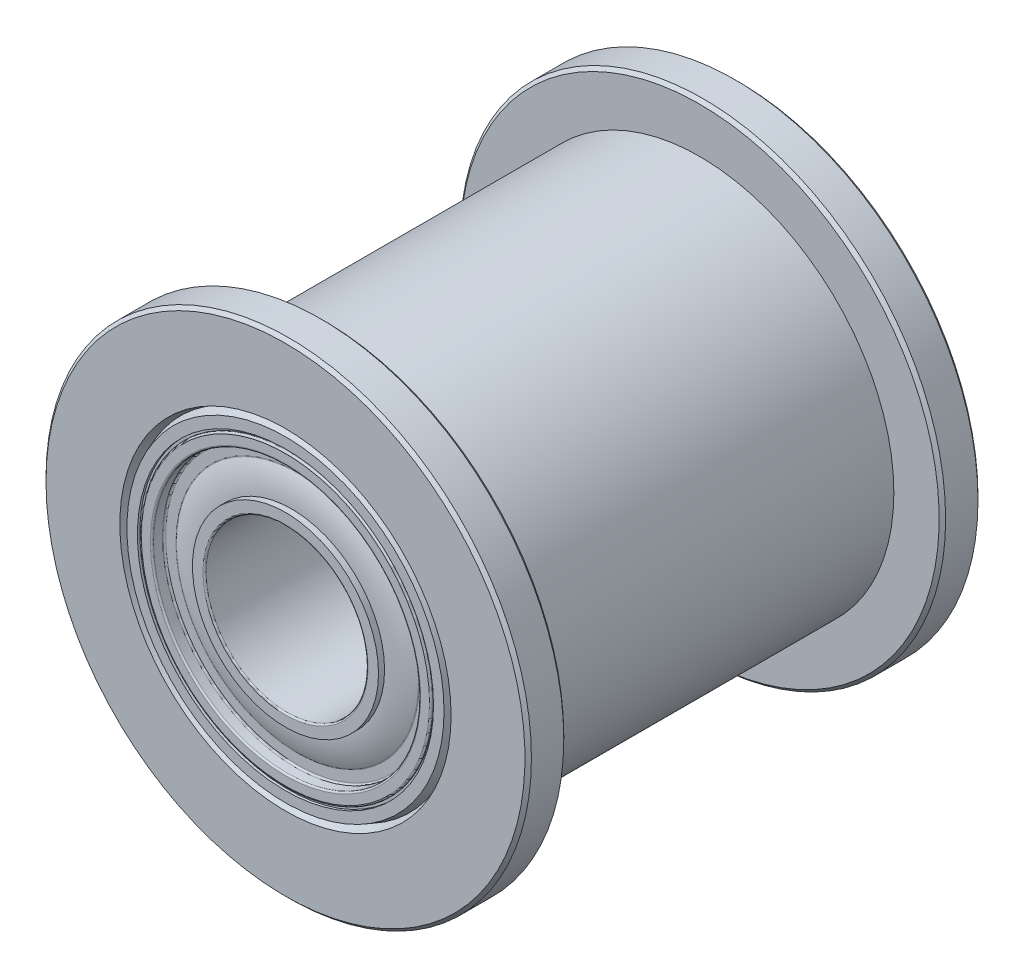
ISO-10303-21;
HEADER;
FILE_DESCRIPTION(('STEP AP214'),'2;1');
FILE_NAME('part.step','',(''),(''),'','','');
FILE_SCHEMA(('AUTOMOTIVE_DESIGN { 1 0 10303 214 1 1 1 1 }'));
ENDSEC;
DATA;
#1=APPLICATION_CONTEXT('core data for automotive mechanical design processes');
#2=APPLICATION_PROTOCOL_DEFINITION('international standard','automotive_design',2000,#1);
#3=PRODUCT_CONTEXT('',#1,'mechanical');
#4=PRODUCT('Part','Part','',(#3));
#5=PRODUCT_RELATED_PRODUCT_CATEGORY('part','',(#4));
#6=PRODUCT_DEFINITION_FORMATION('','',#4);
#7=PRODUCT_DEFINITION_CONTEXT('part definition',#1,'design');
#8=PRODUCT_DEFINITION('design','',#6,#7);
#9=PRODUCT_DEFINITION_SHAPE('','',#8);
#10=(LENGTH_UNIT() NAMED_UNIT(*) SI_UNIT(.MILLI.,.METRE.));
#11=(NAMED_UNIT(*) PLANE_ANGLE_UNIT() SI_UNIT($,.RADIAN.));
#12=(NAMED_UNIT(*) SI_UNIT($,.STERADIAN.) SOLID_ANGLE_UNIT());
#13=UNCERTAINTY_MEASURE_WITH_UNIT(LENGTH_MEASURE(1.E-05),#10,'distance_accuracy_value','');
#14=(GEOMETRIC_REPRESENTATION_CONTEXT(3) GLOBAL_UNCERTAINTY_ASSIGNED_CONTEXT((#13)) GLOBAL_UNIT_ASSIGNED_CONTEXT((#10,
#11,#12)) REPRESENTATION_CONTEXT('',''));
#15=CARTESIAN_POINT('',(0.,0.,0.));
#16=DIRECTION('',(0.,0.,1.));
#17=DIRECTION('',(1.,0.,0.));
#18=AXIS2_PLACEMENT_3D('',#15,#16,#17);
#19=CARTESIAN_POINT('',(0.,7.5,-5.8));
#20=DIRECTION('',(0.,0.,-1.));
#21=DIRECTION('',(-1.,0.,0.));
#22=AXIS2_PLACEMENT_3D('',#19,#20,#21);
#23=PLANE('',#22);
#24=CARTESIAN_POINT('',(0.,0.,-5.8));
#25=DIRECTION('',(0.,0.,-1.));
#26=DIRECTION('',(-1.,0.,0.));
#27=AXIS2_PLACEMENT_3D('',#24,#25,#26);
#28=CIRCLE('',#27,7.40000000000001);
#29=CARTESIAN_POINT('',(-7.40000000000001,0.,-5.8));
#30=VERTEX_POINT('',#29);
#31=EDGE_CURVE('E57',#30,#30,#28,.F.);
#32=ORIENTED_EDGE('',*,*,#31,.T.);
#33=EDGE_LOOP('',(#32));
#34=FACE_BOUND('',#33,.T.);
#35=CARTESIAN_POINT('',(0.,0.,-5.8));
#36=DIRECTION('',(0.,0.,1.));
#37=DIRECTION('',(1.,0.,0.));
#38=AXIS2_PLACEMENT_3D('',#35,#36,#37);
#39=CIRCLE('',#38,6.);
#40=CARTESIAN_POINT('',(6.,0.,-5.8));
#41=VERTEX_POINT('',#40);
#42=EDGE_CURVE('E88',#41,#41,#39,.T.);
#43=ORIENTED_EDGE('',*,*,#42,.F.);
#44=EDGE_LOOP('',(#43));
#45=FACE_BOUND('',#44,.T.);
#46=ADVANCED_FACE('F37',(#34,#45),#23,.F.);
#47=CARTESIAN_POINT('',(0.,0.,7.));
#48=DIRECTION('',(0.,0.,1.));
#49=DIRECTION('',(1.,0.,0.));
#50=AXIS2_PLACEMENT_3D('',#47,#48,#49);
#51=CYLINDRICAL_SURFACE('',#50,7.5);
#52=CARTESIAN_POINT('',(0.,0.,-6.9));
#53=DIRECTION('',(0.,0.,1.));
#54=DIRECTION('',(1.,0.,0.));
#55=AXIS2_PLACEMENT_3D('',#52,#53,#54);
#56=CIRCLE('',#55,7.5);
#57=CARTESIAN_POINT('',(7.5,0.,-6.9));
#58=VERTEX_POINT('',#57);
#59=EDGE_CURVE('E63',#58,#58,#56,.T.);
#60=ORIENTED_EDGE('',*,*,#59,.T.);
#61=EDGE_LOOP('',(#60));
#62=FACE_BOUND('',#61,.T.);
#63=CARTESIAN_POINT('',(0.,0.,-5.9));
#64=DIRECTION('',(0.,0.,-1.));
#65=DIRECTION('',(-1.,0.,0.));
#66=AXIS2_PLACEMENT_3D('',#63,#64,#65);
#67=CIRCLE('',#66,7.5);
#68=CARTESIAN_POINT('',(-7.5,0.,-5.9));
#69=VERTEX_POINT('',#68);
#70=EDGE_CURVE('E66',#69,#69,#67,.T.);
#71=ORIENTED_EDGE('',*,*,#70,.T.);
#72=EDGE_LOOP('',(#71));
#73=FACE_BOUND('',#72,.T.);
#74=ADVANCED_FACE('F203',(#62,#73),#51,.T.);
#75=CARTESIAN_POINT('',(0.,7.5,-7.));
#76=DIRECTION('',(0.,0.,1.));
#77=DIRECTION('',(1.,0.,0.));
#78=AXIS2_PLACEMENT_3D('',#75,#76,#77);
#79=PLANE('',#78);
#80=CARTESIAN_POINT('',(0.,0.,-7.));
#81=DIRECTION('',(0.,0.,1.));
#82=DIRECTION('',(1.,0.,0.));
#83=AXIS2_PLACEMENT_3D('',#80,#81,#82);
#84=CIRCLE('',#83,7.4);
#85=CARTESIAN_POINT('',(7.4,0.,-7.));
#86=VERTEX_POINT('',#85);
#87=EDGE_CURVE('E60',#86,#86,#84,.F.);
#88=ORIENTED_EDGE('',*,*,#87,.T.);
#89=EDGE_LOOP('',(#88));
#90=FACE_BOUND('',#89,.T.);
#91=CARTESIAN_POINT('',(0.,0.,-7.));
#92=DIRECTION('',(0.,0.,1.));
#93=DIRECTION('',(1.,0.,0.));
#94=AXIS2_PLACEMENT_3D('',#91,#92,#93);
#95=CIRCLE('',#94,5.11838214055972);
#96=CARTESIAN_POINT('',(5.11838214055972,0.,-7.));
#97=VERTEX_POINT('',#96);
#98=EDGE_CURVE('E69',#97,#97,#95,.T.);
#99=ORIENTED_EDGE('',*,*,#98,.T.);
#100=EDGE_LOOP('',(#99));
#101=FACE_BOUND('',#100,.T.);
#102=ADVANCED_FACE('F209',(#90,#101),#79,.F.);
#103=CARTESIAN_POINT('',(0.,0.,-6.7));
#104=DIRECTION('',(0.,0.,-1.));
#105=DIRECTION('',(-1.,0.,0.));
#106=AXIS2_PLACEMENT_3D('',#103,#104,#105);
#107=CONICAL_SURFACE('',#106,5.00919107027986,0.349065850398864);
#108=ORIENTED_EDGE('',*,*,#98,.F.);
#109=EDGE_LOOP('',(#108));
#110=FACE_BOUND('',#109,.T.);
#111=CARTESIAN_POINT('',(0.,0.,-6.7));
#112=DIRECTION('',(0.,0.,1.));
#113=DIRECTION('',(1.,0.,0.));
#114=AXIS2_PLACEMENT_3D('',#111,#112,#113);
#115=CIRCLE('',#114,5.00919107027986);
#116=CARTESIAN_POINT('',(5.00919107027986,0.,-6.7));
#117=VERTEX_POINT('',#116);
#118=EDGE_CURVE('E72',#117,#117,#115,.T.);
#119=ORIENTED_EDGE('',*,*,#118,.T.);
#120=EDGE_LOOP('',(#119));
#121=FACE_BOUND('',#120,.T.);
#122=ADVANCED_FACE('F285',(#110,#121),#107,.F.);
#123=CARTESIAN_POINT('',(0.,0.,-7.));
#124=DIRECTION('',(0.,0.,1.));
#125=DIRECTION('',(1.,0.,0.));
#126=AXIS2_PLACEMENT_3D('',#123,#124,#125);
#127=CONICAL_SURFACE('',#126,4.9,0.349065850398864);
#128=ORIENTED_EDGE('',*,*,#118,.F.);
#129=EDGE_LOOP('',(#128));
#130=FACE_BOUND('',#129,.T.);
#131=CARTESIAN_POINT('',(0.,0.,-7.));
#132=DIRECTION('',(0.,0.,1.));
#133=DIRECTION('',(1.,0.,0.));
#134=AXIS2_PLACEMENT_3D('',#131,#132,#133);
#135=CIRCLE('',#134,4.9);
#136=CARTESIAN_POINT('',(4.9,0.,-7.));
#137=VERTEX_POINT('',#136);
#138=EDGE_CURVE('E75',#137,#137,#135,.T.);
#139=ORIENTED_EDGE('',*,*,#138,.T.);
#140=EDGE_LOOP('',(#139));
#141=FACE_BOUND('',#140,.T.);
#142=ADVANCED_FACE('F281',(#130,#141),#127,.T.);
#143=CARTESIAN_POINT('',(0.,4.9,-7.));
#144=DIRECTION('',(0.,0.,1.));
#145=DIRECTION('',(1.,0.,0.));
#146=AXIS2_PLACEMENT_3D('',#143,#144,#145);
#147=PLANE('',#146);
#148=ORIENTED_EDGE('',*,*,#138,.F.);
#149=EDGE_LOOP('',(#148));
#150=FACE_BOUND('',#149,.T.);
#151=CARTESIAN_POINT('',(0.,0.,-7.));
#152=DIRECTION('',(0.,0.,1.));
#153=DIRECTION('',(1.,0.,0.));
#154=AXIS2_PLACEMENT_3D('',#151,#152,#153);
#155=CIRCLE('',#154,4.575);
#156=CARTESIAN_POINT('',(4.575,0.,-7.));
#157=VERTEX_POINT('',#156);
#158=EDGE_CURVE('E78',#157,#157,#155,.T.);
#159=ORIENTED_EDGE('',*,*,#158,.T.);
#160=EDGE_LOOP('',(#159));
#161=FACE_BOUND('',#160,.T.);
#162=ADVANCED_FACE('F277',(#150,#161),#147,.F.);
#163=CARTESIAN_POINT('',(0.,0.,7.));
#164=DIRECTION('',(0.,0.,1.));
#165=DIRECTION('',(1.,0.,0.));
#166=AXIS2_PLACEMENT_3D('',#163,#164,#165);
#167=CYLINDRICAL_SURFACE('',#166,4.575);
#168=ORIENTED_EDGE('',*,*,#158,.F.);
#169=EDGE_LOOP('',(#168));
#170=FACE_BOUND('',#169,.T.);
#171=CARTESIAN_POINT('',(0.,0.,-6.925));
#172=DIRECTION('',(0.,0.,1.));
#173=DIRECTION('',(1.,0.,0.));
#174=AXIS2_PLACEMENT_3D('',#171,#172,#173);
#175=CIRCLE('',#174,4.575);
#176=CARTESIAN_POINT('',(4.575,0.,-6.925));
#177=VERTEX_POINT('',#176);
#178=EDGE_CURVE('E81',#177,#177,#175,.T.);
#179=ORIENTED_EDGE('',*,*,#178,.T.);
#180=EDGE_LOOP('',(#179));
#181=FACE_BOUND('',#180,.T.);
#182=ADVANCED_FACE('F273',(#170,#181),#167,.F.);
#183=CARTESIAN_POINT('',(0.,4.5,-6.925));
#184=DIRECTION('',(0.,0.,1.));
#185=DIRECTION('',(1.,0.,0.));
#186=AXIS2_PLACEMENT_3D('',#183,#184,#185);
#187=PLANE('',#186);
#188=ORIENTED_EDGE('',*,*,#178,.F.);
#189=EDGE_LOOP('',(#188));
#190=FACE_BOUND('',#189,.T.);
#191=CARTESIAN_POINT('',(0.,0.,-6.925));
#192=DIRECTION('',(0.,0.,1.));
#193=DIRECTION('',(1.,0.,0.));
#194=AXIS2_PLACEMENT_3D('',#191,#192,#193);
#195=CIRCLE('',#194,4.5);
#196=CARTESIAN_POINT('',(4.5,0.,-6.925));
#197=VERTEX_POINT('',#196);
#198=EDGE_CURVE('E85',#197,#197,#195,.T.);
#199=ORIENTED_EDGE('',*,*,#198,.T.);
#200=EDGE_LOOP('',(#199));
#201=FACE_BOUND('',#200,.T.);
#202=ADVANCED_FACE('F269',(#190,#201),#187,.F.);
#203=CARTESIAN_POINT('',(0.,4.5,6.925));
#204=DIRECTION('',(0.,0.,-1.));
#205=DIRECTION('',(-1.,0.,0.));
#206=AXIS2_PLACEMENT_3D('',#203,#204,#205);
#207=PLANE('',#206);
#208=CARTESIAN_POINT('',(0.,0.,6.925));
#209=DIRECTION('',(0.,0.,1.));
#210=DIRECTION('',(1.,0.,0.));
#211=AXIS2_PLACEMENT_3D('',#208,#209,#210);
#212=CIRCLE('',#211,4.5);
#213=CARTESIAN_POINT('',(4.5,0.,6.925));
#214=VERTEX_POINT('',#213);
#215=EDGE_CURVE('E84',#214,#214,#212,.T.);
#216=ORIENTED_EDGE('',*,*,#215,.F.);
#217=EDGE_LOOP('',(#216));
#218=FACE_BOUND('',#217,.T.);
#219=CARTESIAN_POINT('',(0.,0.,6.925));
#220=DIRECTION('',(0.,0.,1.));
#221=DIRECTION('',(1.,0.,0.));
#222=AXIS2_PLACEMENT_3D('',#219,#220,#221);
#223=CIRCLE('',#222,4.575);
#224=CARTESIAN_POINT('',(4.575,0.,6.925));
#225=VERTEX_POINT('',#224);
#226=EDGE_CURVE('E92',#225,#225,#223,.T.);
#227=ORIENTED_EDGE('',*,*,#226,.T.);
#228=EDGE_LOOP('',(#227));
#229=FACE_BOUND('',#228,.T.);
#230=ADVANCED_FACE('F265',(#218,#229),#207,.F.);
#231=CARTESIAN_POINT('',(0.,0.,7.));
#232=DIRECTION('',(0.,0.,1.));
#233=DIRECTION('',(1.,0.,0.));
#234=AXIS2_PLACEMENT_3D('',#231,#232,#233);
#235=CYLINDRICAL_SURFACE('',#234,4.575);
#236=ORIENTED_EDGE('',*,*,#226,.F.);
#237=EDGE_LOOP('',(#236));
#238=FACE_BOUND('',#237,.T.);
#239=CARTESIAN_POINT('',(0.,0.,7.));
#240=DIRECTION('',(0.,0.,1.));
#241=DIRECTION('',(1.,0.,0.));
#242=AXIS2_PLACEMENT_3D('',#239,#240,#241);
#243=CIRCLE('',#242,4.575);
#244=CARTESIAN_POINT('',(4.575,0.,7.));
#245=VERTEX_POINT('',#244);
#246=EDGE_CURVE('E95',#245,#245,#243,.T.);
#247=ORIENTED_EDGE('',*,*,#246,.T.);
#248=EDGE_LOOP('',(#247));
#249=FACE_BOUND('',#248,.T.);
#250=ADVANCED_FACE('F261',(#238,#249),#235,.F.);
#251=CARTESIAN_POINT('',(0.,4.9,7.));
#252=DIRECTION('',(0.,0.,-1.));
#253=DIRECTION('',(-1.,0.,0.));
#254=AXIS2_PLACEMENT_3D('',#251,#252,#253);
#255=PLANE('',#254);
#256=ORIENTED_EDGE('',*,*,#246,.F.);
#257=EDGE_LOOP('',(#256));
#258=FACE_BOUND('',#257,.T.);
#259=CARTESIAN_POINT('',(0.,0.,7.));
#260=DIRECTION('',(0.,0.,1.));
#261=DIRECTION('',(1.,0.,0.));
#262=AXIS2_PLACEMENT_3D('',#259,#260,#261);
#263=CIRCLE('',#262,4.9);
#264=CARTESIAN_POINT('',(4.9,0.,7.));
#265=VERTEX_POINT('',#264);
#266=EDGE_CURVE('E98',#265,#265,#263,.T.);
#267=ORIENTED_EDGE('',*,*,#266,.T.);
#268=EDGE_LOOP('',(#267));
#269=FACE_BOUND('',#268,.T.);
#270=ADVANCED_FACE('F257',(#258,#269),#255,.F.);
#271=CARTESIAN_POINT('',(0.,0.,6.7));
#272=DIRECTION('',(0.,0.,-1.));
#273=DIRECTION('',(-1.,0.,0.));
#274=AXIS2_PLACEMENT_3D('',#271,#272,#273);
#275=CONICAL_SURFACE('',#274,5.00919107027986,0.349065850398864);
#276=ORIENTED_EDGE('',*,*,#266,.F.);
#277=EDGE_LOOP('',(#276));
#278=FACE_BOUND('',#277,.T.);
#279=CARTESIAN_POINT('',(0.,0.,6.7));
#280=DIRECTION('',(0.,0.,1.));
#281=DIRECTION('',(1.,0.,0.));
#282=AXIS2_PLACEMENT_3D('',#279,#280,#281);
#283=CIRCLE('',#282,5.00919107027986);
#284=CARTESIAN_POINT('',(5.00919107027986,0.,6.7));
#285=VERTEX_POINT('',#284);
#286=EDGE_CURVE('E101',#285,#285,#283,.T.);
#287=ORIENTED_EDGE('',*,*,#286,.T.);
#288=EDGE_LOOP('',(#287));
#289=FACE_BOUND('',#288,.T.);
#290=ADVANCED_FACE('F253',(#278,#289),#275,.T.);
#291=CARTESIAN_POINT('',(0.,0.,7.));
#292=DIRECTION('',(0.,0.,1.));
#293=DIRECTION('',(1.,0.,0.));
#294=AXIS2_PLACEMENT_3D('',#291,#292,#293);
#295=CONICAL_SURFACE('',#294,5.11838214055972,0.349065850398864);
#296=ORIENTED_EDGE('',*,*,#286,.F.);
#297=EDGE_LOOP('',(#296));
#298=FACE_BOUND('',#297,.T.);
#299=CARTESIAN_POINT('',(0.,0.,7.));
#300=DIRECTION('',(0.,0.,1.));
#301=DIRECTION('',(1.,0.,0.));
#302=AXIS2_PLACEMENT_3D('',#299,#300,#301);
#303=CIRCLE('',#302,5.11838214055972);
#304=CARTESIAN_POINT('',(5.11838214055972,0.,7.));
#305=VERTEX_POINT('',#304);
#306=EDGE_CURVE('E104',#305,#305,#303,.T.);
#307=ORIENTED_EDGE('',*,*,#306,.T.);
#308=EDGE_LOOP('',(#307));
#309=FACE_BOUND('',#308,.T.);
#310=ADVANCED_FACE('F247',(#298,#309),#295,.F.);
#311=CARTESIAN_POINT('',(0.,7.5,7.));
#312=DIRECTION('',(0.,0.,-1.));
#313=DIRECTION('',(-1.,0.,0.));
#314=AXIS2_PLACEMENT_3D('',#311,#312,#313);
#315=PLANE('',#314);
#316=CARTESIAN_POINT('',(0.,0.,7.));
#317=DIRECTION('',(0.,0.,-1.));
#318=DIRECTION('',(-1.,0.,0.));
#319=AXIS2_PLACEMENT_3D('',#316,#317,#318);
#320=CIRCLE('',#319,7.4);
#321=CARTESIAN_POINT('',(-7.4,0.,7.));
#322=VERTEX_POINT('',#321);
#323=EDGE_CURVE('E10',#322,#322,#320,.F.);
#324=ORIENTED_EDGE('',*,*,#323,.T.);
#325=EDGE_LOOP('',(#324));
#326=FACE_BOUND('',#325,.T.);
#327=ORIENTED_EDGE('',*,*,#306,.F.);
#328=EDGE_LOOP('',(#327));
#329=FACE_BOUND('',#328,.T.);
#330=ADVANCED_FACE('F238',(#326,#329),#315,.F.);
#331=CARTESIAN_POINT('',(0.,0.,7.));
#332=DIRECTION('',(0.,0.,1.));
#333=DIRECTION('',(1.,0.,0.));
#334=AXIS2_PLACEMENT_3D('',#331,#332,#333);
#335=CYLINDRICAL_SURFACE('',#334,7.5);
#336=CARTESIAN_POINT('',(0.,0.,5.9));
#337=DIRECTION('',(0.,0.,1.));
#338=DIRECTION('',(1.,0.,0.));
#339=AXIS2_PLACEMENT_3D('',#336,#337,#338);
#340=CIRCLE('',#339,7.5);
#341=CARTESIAN_POINT('',(7.5,0.,5.9));
#342=VERTEX_POINT('',#341);
#343=EDGE_CURVE('E48',#342,#342,#340,.T.);
#344=ORIENTED_EDGE('',*,*,#343,.T.);
#345=EDGE_LOOP('',(#344));
#346=FACE_BOUND('',#345,.T.);
#347=CARTESIAN_POINT('',(0.,0.,6.9));
#348=DIRECTION('',(0.,0.,-1.));
#349=DIRECTION('',(-1.,0.,0.));
#350=AXIS2_PLACEMENT_3D('',#347,#348,#349);
#351=CIRCLE('',#350,7.5);
#352=CARTESIAN_POINT('',(-7.5,0.,6.9));
#353=VERTEX_POINT('',#352);
#354=EDGE_CURVE('E52',#353,#353,#351,.T.);
#355=ORIENTED_EDGE('',*,*,#354,.T.);
#356=EDGE_LOOP('',(#355));
#357=FACE_BOUND('',#356,.T.);
#358=ADVANCED_FACE('F234',(#346,#357),#335,.T.);
#359=CARTESIAN_POINT('',(0.,7.5,5.8));
#360=DIRECTION('',(0.,0.,1.));
#361=DIRECTION('',(1.,0.,0.));
#362=AXIS2_PLACEMENT_3D('',#359,#360,#361);
#363=PLANE('',#362);
#364=CARTESIAN_POINT('',(0.,0.,5.8));
#365=DIRECTION('',(0.,0.,1.));
#366=DIRECTION('',(1.,0.,0.));
#367=AXIS2_PLACEMENT_3D('',#364,#365,#366);
#368=CIRCLE('',#367,7.4);
#369=CARTESIAN_POINT('',(7.4,0.,5.8));
#370=VERTEX_POINT('',#369);
#371=EDGE_CURVE('E44',#370,#370,#368,.F.);
#372=ORIENTED_EDGE('',*,*,#371,.T.);
#373=EDGE_LOOP('',(#372));
#374=FACE_BOUND('',#373,.T.);
#375=CARTESIAN_POINT('',(0.,0.,5.8));
#376=DIRECTION('',(0.,0.,1.));
#377=DIRECTION('',(1.,0.,0.));
#378=AXIS2_PLACEMENT_3D('',#375,#376,#377);
#379=CIRCLE('',#378,6.);
#380=CARTESIAN_POINT('',(6.,0.,5.8));
#381=VERTEX_POINT('',#380);
#382=EDGE_CURVE('E107',#381,#381,#379,.T.);
#383=ORIENTED_EDGE('',*,*,#382,.T.);
#384=EDGE_LOOP('',(#383));
#385=FACE_BOUND('',#384,.T.);
#386=ADVANCED_FACE('F237',(#374,#385),#363,.F.);
#387=CARTESIAN_POINT('',(0.,0.,7.));
#388=DIRECTION('',(0.,0.,1.));
#389=DIRECTION('',(1.,0.,0.));
#390=AXIS2_PLACEMENT_3D('',#387,#388,#389);
#391=CYLINDRICAL_SURFACE('',#390,6.);
#392=ORIENTED_EDGE('',*,*,#382,.F.);
#393=EDGE_LOOP('',(#392));
#394=FACE_BOUND('',#393,.T.);
#395=ORIENTED_EDGE('',*,*,#42,.T.);
#396=EDGE_LOOP('',(#395));
#397=FACE_BOUND('',#396,.T.);
#398=ADVANCED_FACE('F219',(#394,#397),#391,.T.);
#399=CARTESIAN_POINT('',(0.,0.,-6.9));
#400=DIRECTION('',(0.,0.,1.));
#401=DIRECTION('',(1.,0.,0.));
#402=AXIS2_PLACEMENT_3D('',#399,#400,#401);
#403=CONICAL_SURFACE('',#402,7.5,0.78539816339744);
#404=ORIENTED_EDGE('',*,*,#87,.F.);
#405=EDGE_LOOP('',(#404));
#406=FACE_BOUND('',#405,.T.);
#407=ORIENTED_EDGE('',*,*,#59,.F.);
#408=EDGE_LOOP('',(#407));
#409=FACE_BOUND('',#408,.T.);
#410=ADVANCED_FACE('F215',(#406,#409),#403,.T.);
#411=CARTESIAN_POINT('',(0.,0.,-5.8));
#412=DIRECTION('',(0.,0.,-1.));
#413=DIRECTION('',(-1.,0.,0.));
#414=AXIS2_PLACEMENT_3D('',#411,#412,#413);
#415=CONICAL_SURFACE('',#414,7.40000000000001,0.785398163397457);
#416=ORIENTED_EDGE('',*,*,#70,.F.);
#417=EDGE_LOOP('',(#416));
#418=FACE_BOUND('',#417,.T.);
#419=ORIENTED_EDGE('',*,*,#31,.F.);
#420=EDGE_LOOP('',(#419));
#421=FACE_BOUND('',#420,.T.);
#422=ADVANCED_FACE('F218',(#418,#421),#415,.T.);
#423=CARTESIAN_POINT('',(0.,0.,5.9));
#424=DIRECTION('',(0.,0.,1.));
#425=DIRECTION('',(1.,0.,0.));
#426=AXIS2_PLACEMENT_3D('',#423,#424,#425);
#427=CONICAL_SURFACE('',#426,7.5,0.785398163397444);
#428=ORIENTED_EDGE('',*,*,#371,.F.);
#429=EDGE_LOOP('',(#428));
#430=FACE_BOUND('',#429,.T.);
#431=ORIENTED_EDGE('',*,*,#343,.F.);
#432=EDGE_LOOP('',(#431));
#433=FACE_BOUND('',#432,.T.);
#434=ADVANCED_FACE('F222',(#430,#433),#427,.T.);
#435=CARTESIAN_POINT('',(0.,0.,7.));
#436=DIRECTION('',(0.,0.,-1.));
#437=DIRECTION('',(-1.,0.,0.));
#438=AXIS2_PLACEMENT_3D('',#435,#436,#437);
#439=CONICAL_SURFACE('',#438,7.4,0.785398163397448);
#440=ORIENTED_EDGE('',*,*,#354,.F.);
#441=EDGE_LOOP('',(#440));
#442=FACE_BOUND('',#441,.T.);
#443=ORIENTED_EDGE('',*,*,#323,.F.);
#444=EDGE_LOOP('',(#443));
#445=FACE_BOUND('',#444,.T.);
#446=ADVANCED_FACE('F39',(#442,#445),#439,.T.);
#447=CARTESIAN_POINT('',(0.,0.,7.));
#448=DIRECTION('',(0.,0.,1.));
#449=DIRECTION('',(1.,0.,0.));
#450=AXIS2_PLACEMENT_3D('',#447,#448,#449);
#451=CYLINDRICAL_SURFACE('',#450,4.5);
#452=CARTESIAN_POINT('',(0.,0.,6.95));
#453=DIRECTION('',(0.,0.,-1.));
#454=DIRECTION('',(-1.,0.,0.));
#455=AXIS2_PLACEMENT_3D('',#452,#453,#454);
#456=CIRCLE('',#455,4.5);
#457=CARTESIAN_POINT('',(-4.5,0.,6.95));
#458=VERTEX_POINT('',#457);
#459=EDGE_CURVE('E153',#458,#458,#456,.T.);
#460=ORIENTED_EDGE('',*,*,#459,.T.);
#461=EDGE_LOOP('',(#460));
#462=FACE_BOUND('',#461,.T.);
#463=ORIENTED_EDGE('',*,*,#215,.T.);
#464=EDGE_LOOP('',(#463));
#465=FACE_BOUND('',#464,.T.);
#466=ADVANCED_FACE('F229',(#462,#465),#451,.T.);
#467=CARTESIAN_POINT('',(0.,2.5,-7.));
#468=DIRECTION('',(0.,0.,1.));
#469=DIRECTION('',(1.,0.,0.));
#470=AXIS2_PLACEMENT_3D('',#467,#468,#469);
#471=PLANE('',#470);
#472=CARTESIAN_POINT('',(0.,0.,-7.));
#473=DIRECTION('',(0.,0.,1.));
#474=DIRECTION('',(1.,0.,0.));
#475=AXIS2_PLACEMENT_3D('',#472,#473,#474);
#476=CIRCLE('',#475,2.55);
#477=CARTESIAN_POINT('',(2.55,0.,-7.));
#478=VERTEX_POINT('',#477);
#479=EDGE_CURVE('E165',#478,#478,#476,.T.);
#480=ORIENTED_EDGE('',*,*,#479,.T.);
#481=EDGE_LOOP('',(#480));
#482=FACE_BOUND('',#481,.T.);
#483=CARTESIAN_POINT('',(0.,0.,-7.));
#484=DIRECTION('',(0.,0.,1.));
#485=DIRECTION('',(1.,0.,0.));
#486=AXIS2_PLACEMENT_3D('',#483,#484,#485);
#487=CIRCLE('',#486,2.825);
#488=CARTESIAN_POINT('',(2.825,0.,-7.));
#489=VERTEX_POINT('',#488);
#490=EDGE_CURVE('E168',#489,#489,#487,.F.);
#491=ORIENTED_EDGE('',*,*,#490,.T.);
#492=EDGE_LOOP('',(#491));
#493=FACE_BOUND('',#492,.T.);
#494=ADVANCED_FACE('F473',(#482,#493),#471,.F.);
#495=CARTESIAN_POINT('',(0.,0.,7.));
#496=DIRECTION('',(0.,0.,1.));
#497=DIRECTION('',(1.,0.,0.));
#498=AXIS2_PLACEMENT_3D('',#495,#496,#497);
#499=CYLINDRICAL_SURFACE('',#498,2.5);
#500=CARTESIAN_POINT('',(0.,0.,-6.95));
#501=DIRECTION('',(0.,0.,1.));
#502=DIRECTION('',(1.,0.,0.));
#503=AXIS2_PLACEMENT_3D('',#500,#501,#502);
#504=CIRCLE('',#503,2.5);
#505=CARTESIAN_POINT('',(2.5,0.,-6.95));
#506=VERTEX_POINT('',#505);
#507=EDGE_CURVE('E159',#506,#506,#504,.F.);
#508=ORIENTED_EDGE('',*,*,#507,.T.);
#509=EDGE_LOOP('',(#508));
#510=FACE_BOUND('',#509,.T.);
#511=CARTESIAN_POINT('',(0.,0.,6.95));
#512=DIRECTION('',(0.,0.,-1.));
#513=DIRECTION('',(-1.,0.,0.));
#514=AXIS2_PLACEMENT_3D('',#511,#512,#513);
#515=CIRCLE('',#514,2.5);
#516=CARTESIAN_POINT('',(-2.5,0.,6.95));
#517=VERTEX_POINT('',#516);
#518=EDGE_CURVE('E162',#517,#517,#515,.F.);
#519=ORIENTED_EDGE('',*,*,#518,.T.);
#520=EDGE_LOOP('',(#519));
#521=FACE_BOUND('',#520,.T.);
#522=ADVANCED_FACE('F311',(#510,#521),#499,.F.);
#523=ORIENTED_EDGE('',*,*,#198,.F.);
#524=EDGE_LOOP('',(#523));
#525=FACE_BOUND('',#524,.T.);
#526=CARTESIAN_POINT('',(0.,0.,-6.95));
#527=DIRECTION('',(0.,0.,1.));
#528=DIRECTION('',(1.,0.,0.));
#529=AXIS2_PLACEMENT_3D('',#526,#527,#528);
#530=CIRCLE('',#529,4.5);
#531=CARTESIAN_POINT('',(4.5,0.,-6.95));
#532=VERTEX_POINT('',#531);
#533=EDGE_CURVE('E150',#532,#532,#530,.T.);
#534=ORIENTED_EDGE('',*,*,#533,.T.);
#535=EDGE_LOOP('',(#534));
#536=FACE_BOUND('',#535,.T.);
#537=ADVANCED_FACE('F307',(#525,#536),#451,.T.);
#538=CARTESIAN_POINT('',(0.,4.5,-7.));
#539=DIRECTION('',(0.,0.,1.));
#540=DIRECTION('',(1.,0.,0.));
#541=AXIS2_PLACEMENT_3D('',#538,#539,#540);
#542=PLANE('',#541);
#543=CARTESIAN_POINT('',(0.,0.,-7.));
#544=DIRECTION('',(0.,0.,1.));
#545=DIRECTION('',(1.,0.,0.));
#546=AXIS2_PLACEMENT_3D('',#543,#544,#545);
#547=CIRCLE('',#546,4.45);
#548=CARTESIAN_POINT('',(4.45,0.,-7.));
#549=VERTEX_POINT('',#548);
#550=EDGE_CURVE('E144',#549,#549,#547,.F.);
#551=ORIENTED_EDGE('',*,*,#550,.T.);
#552=EDGE_LOOP('',(#551));
#553=FACE_BOUND('',#552,.T.);
#554=CARTESIAN_POINT('',(0.,0.,-7.));
#555=DIRECTION('',(0.,0.,1.));
#556=DIRECTION('',(1.,0.,0.));
#557=AXIS2_PLACEMENT_3D('',#554,#555,#556);
#558=CIRCLE('',#557,4.175);
#559=CARTESIAN_POINT('',(4.175,0.,-7.));
#560=VERTEX_POINT('',#559);
#561=EDGE_CURVE('E147',#560,#560,#558,.T.);
#562=ORIENTED_EDGE('',*,*,#561,.T.);
#563=EDGE_LOOP('',(#562));
#564=FACE_BOUND('',#563,.T.);
#565=ADVANCED_FACE('F310',(#553,#564),#542,.F.);
#566=CARTESIAN_POINT('',(0.,0.,7.));
#567=DIRECTION('',(0.,0.,1.));
#568=DIRECTION('',(1.,0.,0.));
#569=AXIS2_PLACEMENT_3D('',#566,#567,#568);
#570=CYLINDRICAL_SURFACE('',#569,4.125);
#571=CARTESIAN_POINT('',(0.,0.,-6.95));
#572=DIRECTION('',(0.,0.,1.));
#573=DIRECTION('',(1.,0.,0.));
#574=AXIS2_PLACEMENT_3D('',#571,#572,#573);
#575=CIRCLE('',#574,4.125);
#576=CARTESIAN_POINT('',(4.125,0.,-6.95));
#577=VERTEX_POINT('',#576);
#578=EDGE_CURVE('E135',#577,#577,#575,.F.);
#579=ORIENTED_EDGE('',*,*,#578,.T.);
#580=EDGE_LOOP('',(#579));
#581=FACE_BOUND('',#580,.T.);
#582=CARTESIAN_POINT('',(0.,0.,-6.625));
#583=DIRECTION('',(0.,0.,1.));
#584=DIRECTION('',(1.,0.,0.));
#585=AXIS2_PLACEMENT_3D('',#582,#583,#584);
#586=CIRCLE('',#585,4.125);
#587=CARTESIAN_POINT('',(4.125,0.,-6.625));
#588=VERTEX_POINT('',#587);
#589=EDGE_CURVE('E171',#588,#588,#586,.T.);
#590=ORIENTED_EDGE('',*,*,#589,.T.);
#591=EDGE_LOOP('',(#590));
#592=FACE_BOUND('',#591,.T.);
#593=ADVANCED_FACE('F509',(#581,#592),#570,.F.);
#594=CARTESIAN_POINT('',(0.,3.75,-6.625));
#595=DIRECTION('',(0.,0.,1.));
#596=DIRECTION('',(1.,0.,0.));
#597=AXIS2_PLACEMENT_3D('',#594,#595,#596);
#598=PLANE('',#597);
#599=CARTESIAN_POINT('',(0.,0.,-6.625));
#600=DIRECTION('',(0.,0.,1.));
#601=DIRECTION('',(1.,0.,0.));
#602=AXIS2_PLACEMENT_3D('',#599,#600,#601);
#603=CIRCLE('',#602,3.76064947919592);
#604=CARTESIAN_POINT('',(3.76064947919592,0.,-6.625));
#605=VERTEX_POINT('',#604);
#606=EDGE_CURVE('E141',#605,#605,#603,.T.);
#607=ORIENTED_EDGE('',*,*,#606,.T.);
#608=EDGE_LOOP('',(#607));
#609=FACE_BOUND('',#608,.T.);
#610=ORIENTED_EDGE('',*,*,#589,.F.);
#611=EDGE_LOOP('',(#610));
#612=FACE_BOUND('',#611,.T.);
#613=ADVANCED_FACE('F519',(#609,#612),#598,.F.);
#614=CARTESIAN_POINT('',(0.,0.,-4.67708333333337));
#615=DIRECTION('',(0.,0.,1.));
#616=DIRECTION('',(1.,0.,0.));
#617=AXIS2_PLACEMENT_3D('',#614,#615,#616);
#618=TOROIDAL_SURFACE('',#617,2.875,2.13541666666663);
#619=CARTESIAN_POINT('',(0.,0.,-6.62928979980934));
#620=DIRECTION('',(0.,0.,1.));
#621=DIRECTION('',(1.,0.,0.));
#622=AXIS2_PLACEMENT_3D('',#619,#620,#621);
#623=CIRCLE('',#622,3.74038676470526);
#624=CARTESIAN_POINT('',(3.74038676470526,0.,-6.62928979980934));
#625=VERTEX_POINT('',#624);
#626=EDGE_CURVE('E138',#625,#625,#623,.F.);
#627=ORIENTED_EDGE('',*,*,#626,.T.);
#628=EDGE_LOOP('',(#627));
#629=FACE_BOUND('',#628,.T.);
#630=CARTESIAN_POINT('',(0.,0.,-6.8125));
#631=DIRECTION('',(0.,0.,1.));
#632=DIRECTION('',(1.,0.,0.));
#633=AXIS2_PLACEMENT_3D('',#630,#631,#632);
#634=CIRCLE('',#633,2.875);
#635=CARTESIAN_POINT('',(2.875,0.,-6.8125));
#636=VERTEX_POINT('',#635);
#637=EDGE_CURVE('E174',#636,#636,#634,.T.);
#638=ORIENTED_EDGE('',*,*,#637,.T.);
#639=EDGE_LOOP('',(#638));
#640=FACE_BOUND('',#639,.T.);
#641=ADVANCED_FACE('F529',(#629,#640),#618,.T.);
#642=CARTESIAN_POINT('',(0.,0.,7.));
#643=DIRECTION('',(0.,0.,1.));
#644=DIRECTION('',(1.,0.,0.));
#645=AXIS2_PLACEMENT_3D('',#642,#643,#644);
#646=CYLINDRICAL_SURFACE('',#645,2.875);
#647=CARTESIAN_POINT('',(0.,0.,-6.95));
#648=DIRECTION('',(0.,0.,1.));
#649=DIRECTION('',(1.,0.,0.));
#650=AXIS2_PLACEMENT_3D('',#647,#648,#649);
#651=CIRCLE('',#650,2.875);
#652=CARTESIAN_POINT('',(2.875,0.,-6.95));
#653=VERTEX_POINT('',#652);
#654=EDGE_CURVE('E156',#653,#653,#651,.T.);
#655=ORIENTED_EDGE('',*,*,#654,.T.);
#656=EDGE_LOOP('',(#655));
#657=FACE_BOUND('',#656,.T.);
#658=ORIENTED_EDGE('',*,*,#637,.F.);
#659=EDGE_LOOP('',(#658));
#660=FACE_BOUND('',#659,.T.);
#661=ADVANCED_FACE('F539',(#657,#660),#646,.T.);
#662=CARTESIAN_POINT('',(0.,2.5,7.));
#663=DIRECTION('',(0.,0.,-1.));
#664=DIRECTION('',(1.,0.,0.));
#665=AXIS2_PLACEMENT_3D('',#662,#663,#664);
#666=PLANE('',#665);
#667=CARTESIAN_POINT('',(0.,0.,7.));
#668=DIRECTION('',(0.,0.,-1.));
#669=DIRECTION('',(-1.,0.,0.));
#670=AXIS2_PLACEMENT_3D('',#667,#668,#669);
#671=CIRCLE('',#670,2.55);
#672=CARTESIAN_POINT('',(-2.55,0.,7.));
#673=VERTEX_POINT('',#672);
#674=EDGE_CURVE('E89',#673,#673,#671,.T.);
#675=ORIENTED_EDGE('',*,*,#674,.T.);
#676=EDGE_LOOP('',(#675));
#677=FACE_BOUND('',#676,.T.);
#678=CARTESIAN_POINT('',(0.,0.,7.));
#679=DIRECTION('',(0.,0.,1.));
#680=DIRECTION('',(1.,0.,0.));
#681=AXIS2_PLACEMENT_3D('',#678,#679,#680);
#682=CIRCLE('',#681,2.875);
#683=CARTESIAN_POINT('',(2.875,0.,7.));
#684=VERTEX_POINT('',#683);
#685=EDGE_CURVE('E180',#684,#684,#682,.T.);
#686=ORIENTED_EDGE('',*,*,#685,.T.);
#687=EDGE_LOOP('',(#686));
#688=FACE_BOUND('',#687,.T.);
#689=ADVANCED_FACE('F184',(#677,#688),#666,.F.);
#690=CARTESIAN_POINT('',(0.,4.5,7.));
#691=DIRECTION('',(0.,0.,-1.));
#692=DIRECTION('',(1.,0.,0.));
#693=AXIS2_PLACEMENT_3D('',#690,#691,#692);
#694=PLANE('',#693);
#695=CARTESIAN_POINT('',(0.,0.,7.));
#696=DIRECTION('',(0.,0.,-1.));
#697=DIRECTION('',(-1.,0.,0.));
#698=AXIS2_PLACEMENT_3D('',#695,#696,#697);
#699=CIRCLE('',#698,4.45);
#700=CARTESIAN_POINT('',(-4.45,0.,7.));
#701=VERTEX_POINT('',#700);
#702=EDGE_CURVE('E114',#701,#701,#699,.F.);
#703=ORIENTED_EDGE('',*,*,#702,.T.);
#704=EDGE_LOOP('',(#703));
#705=FACE_BOUND('',#704,.T.);
#706=CARTESIAN_POINT('',(0.,0.,7.));
#707=DIRECTION('',(0.,0.,-1.));
#708=DIRECTION('',(-1.,0.,0.));
#709=AXIS2_PLACEMENT_3D('',#706,#707,#708);
#710=CIRCLE('',#709,4.175);
#711=CARTESIAN_POINT('',(-4.175,0.,7.));
#712=VERTEX_POINT('',#711);
#713=EDGE_CURVE('E117',#712,#712,#710,.T.);
#714=ORIENTED_EDGE('',*,*,#713,.T.);
#715=EDGE_LOOP('',(#714));
#716=FACE_BOUND('',#715,.T.);
#717=ADVANCED_FACE('F558',(#705,#716),#694,.F.);
#718=CARTESIAN_POINT('',(0.,0.,-7.));
#719=DIRECTION('',(0.,0.,-1.));
#720=DIRECTION('',(1.,0.,0.));
#721=AXIS2_PLACEMENT_3D('',#718,#719,#720);
#722=CYLINDRICAL_SURFACE('',#721,4.125);
#723=CARTESIAN_POINT('',(0.,0.,6.675));
#724=DIRECTION('',(0.,0.,-1.));
#725=DIRECTION('',(-1.,0.,0.));
#726=AXIS2_PLACEMENT_3D('',#723,#724,#725);
#727=CIRCLE('',#726,4.125);
#728=CARTESIAN_POINT('',(-4.125,0.,6.675));
#729=VERTEX_POINT('',#728);
#730=EDGE_CURVE('E120',#729,#729,#727,.T.);
#731=ORIENTED_EDGE('',*,*,#730,.T.);
#732=EDGE_LOOP('',(#731));
#733=FACE_BOUND('',#732,.T.);
#734=CARTESIAN_POINT('',(0.,0.,6.95));
#735=DIRECTION('',(0.,0.,-1.));
#736=DIRECTION('',(-1.,0.,0.));
#737=AXIS2_PLACEMENT_3D('',#734,#735,#736);
#738=CIRCLE('',#737,4.125);
#739=CARTESIAN_POINT('',(-4.125,0.,6.95));
#740=VERTEX_POINT('',#739);
#741=EDGE_CURVE('E123',#740,#740,#738,.F.);
#742=ORIENTED_EDGE('',*,*,#741,.T.);
#743=EDGE_LOOP('',(#742));
#744=FACE_BOUND('',#743,.T.);
#745=ADVANCED_FACE('F568',(#733,#744),#722,.F.);
#746=CARTESIAN_POINT('',(0.,3.75,6.625));
#747=DIRECTION('',(0.,0.,-1.));
#748=DIRECTION('',(1.,0.,0.));
#749=AXIS2_PLACEMENT_3D('',#746,#747,#748);
#750=PLANE('',#749);
#751=CARTESIAN_POINT('',(0.,0.,6.625));
#752=DIRECTION('',(0.,0.,-1.));
#753=DIRECTION('',(-1.,0.,0.));
#754=AXIS2_PLACEMENT_3D('',#751,#752,#753);
#755=CIRCLE('',#754,3.76064947919592);
#756=CARTESIAN_POINT('',(-3.76064947919592,0.,6.625));
#757=VERTEX_POINT('',#756);
#758=EDGE_CURVE('E126',#757,#757,#755,.T.);
#759=ORIENTED_EDGE('',*,*,#758,.T.);
#760=EDGE_LOOP('',(#759));
#761=FACE_BOUND('',#760,.T.);
#762=CARTESIAN_POINT('',(0.,0.,6.625));
#763=DIRECTION('',(0.,0.,-1.));
#764=DIRECTION('',(-1.,0.,0.));
#765=AXIS2_PLACEMENT_3D('',#762,#763,#764);
#766=CIRCLE('',#765,4.075);
#767=CARTESIAN_POINT('',(-4.075,0.,6.625));
#768=VERTEX_POINT('',#767);
#769=EDGE_CURVE('E129',#768,#768,#766,.F.);
#770=ORIENTED_EDGE('',*,*,#769,.T.);
#771=EDGE_LOOP('',(#770));
#772=FACE_BOUND('',#771,.T.);
#773=ADVANCED_FACE('F199',(#761,#772),#750,.F.);
#774=CARTESIAN_POINT('',(0.,0.,4.67708333333337));
#775=DIRECTION('',(0.,0.,-1.));
#776=DIRECTION('',(1.,0.,0.));
#777=AXIS2_PLACEMENT_3D('',#774,#775,#776);
#778=TOROIDAL_SURFACE('',#777,2.875,2.13541666666663);
#779=CARTESIAN_POINT('',(0.,0.,6.62928979980934));
#780=DIRECTION('',(0.,0.,-1.));
#781=DIRECTION('',(-1.,0.,0.));
#782=AXIS2_PLACEMENT_3D('',#779,#780,#781);
#783=CIRCLE('',#782,3.74038676470526);
#784=CARTESIAN_POINT('',(-3.74038676470526,0.,6.62928979980934));
#785=VERTEX_POINT('',#784);
#786=EDGE_CURVE('E132',#785,#785,#783,.F.);
#787=ORIENTED_EDGE('',*,*,#786,.T.);
#788=EDGE_LOOP('',(#787));
#789=FACE_BOUND('',#788,.T.);
#790=CARTESIAN_POINT('',(0.,0.,6.8125));
#791=DIRECTION('',(0.,0.,1.));
#792=DIRECTION('',(1.,0.,0.));
#793=AXIS2_PLACEMENT_3D('',#790,#791,#792);
#794=CIRCLE('',#793,2.875);
#795=CARTESIAN_POINT('',(2.875,0.,6.8125));
#796=VERTEX_POINT('',#795);
#797=EDGE_CURVE('E177',#796,#796,#794,.T.);
#798=ORIENTED_EDGE('',*,*,#797,.F.);
#799=EDGE_LOOP('',(#798));
#800=FACE_BOUND('',#799,.T.);
#801=ADVANCED_FACE('F189',(#789,#800),#778,.T.);
#802=CARTESIAN_POINT('',(0.,0.,-7.));
#803=DIRECTION('',(0.,0.,-1.));
#804=DIRECTION('',(1.,0.,0.));
#805=AXIS2_PLACEMENT_3D('',#802,#803,#804);
#806=CYLINDRICAL_SURFACE('',#805,2.875);
#807=ORIENTED_EDGE('',*,*,#797,.T.);
#808=EDGE_LOOP('',(#807));
#809=FACE_BOUND('',#808,.T.);
#810=ORIENTED_EDGE('',*,*,#685,.F.);
#811=EDGE_LOOP('',(#810));
#812=FACE_BOUND('',#811,.T.);
#813=ADVANCED_FACE('F186',(#809,#812),#806,.T.);
#814=CARTESIAN_POINT('',(0.,0.,-6.95));
#815=DIRECTION('',(0.,0.,1.));
#816=DIRECTION('',(1.,0.,0.));
#817=AXIS2_PLACEMENT_3D('',#814,#815,#816);
#818=TOROIDAL_SURFACE('',#817,2.55,0.05);
#819=ORIENTED_EDGE('',*,*,#507,.F.);
#820=EDGE_LOOP('',(#819));
#821=FACE_BOUND('',#820,.T.);
#822=ORIENTED_EDGE('',*,*,#479,.F.);
#823=EDGE_LOOP('',(#822));
#824=FACE_BOUND('',#823,.T.);
#825=ADVANCED_FACE('F188',(#821,#824),#818,.T.);
#826=CARTESIAN_POINT('',(0.,0.,-6.95));
#827=DIRECTION('',(0.,0.,1.));
#828=DIRECTION('',(1.,0.,0.));
#829=AXIS2_PLACEMENT_3D('',#826,#827,#828);
#830=TOROIDAL_SURFACE('',#829,2.825,0.05);
#831=ORIENTED_EDGE('',*,*,#490,.F.);
#832=EDGE_LOOP('',(#831));
#833=FACE_BOUND('',#832,.T.);
#834=ORIENTED_EDGE('',*,*,#654,.F.);
#835=EDGE_LOOP('',(#834));
#836=FACE_BOUND('',#835,.T.);
#837=ADVANCED_FACE('F196',(#833,#836),#830,.T.);
#838=CARTESIAN_POINT('',(0.,0.,-6.95));
#839=DIRECTION('',(0.,0.,1.));
#840=DIRECTION('',(1.,0.,0.));
#841=AXIS2_PLACEMENT_3D('',#838,#839,#840);
#842=TOROIDAL_SURFACE('',#841,4.45,0.05);
#843=ORIENTED_EDGE('',*,*,#550,.F.);
#844=EDGE_LOOP('',(#843));
#845=FACE_BOUND('',#844,.T.);
#846=ORIENTED_EDGE('',*,*,#533,.F.);
#847=EDGE_LOOP('',(#846));
#848=FACE_BOUND('',#847,.T.);
#849=ADVANCED_FACE('F315',(#845,#848),#842,.T.);
#850=CARTESIAN_POINT('',(0.,0.,-6.675));
#851=DIRECTION('',(0.,0.,1.));
#852=DIRECTION('',(1.,0.,0.));
#853=AXIS2_PLACEMENT_3D('',#850,#851,#852);
#854=TOROIDAL_SURFACE('',#853,3.76064947919592,0.05);
#855=ORIENTED_EDGE('',*,*,#626,.F.);
#856=EDGE_LOOP('',(#855));
#857=FACE_BOUND('',#856,.T.);
#858=ORIENTED_EDGE('',*,*,#606,.F.);
#859=EDGE_LOOP('',(#858));
#860=FACE_BOUND('',#859,.T.);
#861=ADVANCED_FACE('F317',(#857,#860),#854,.F.);
#862=CARTESIAN_POINT('',(0.,0.,-6.95));
#863=DIRECTION('',(0.,0.,1.));
#864=DIRECTION('',(1.,0.,0.));
#865=AXIS2_PLACEMENT_3D('',#862,#863,#864);
#866=TOROIDAL_SURFACE('',#865,4.175,0.05);
#867=ORIENTED_EDGE('',*,*,#578,.F.);
#868=EDGE_LOOP('',(#867));
#869=FACE_BOUND('',#868,.T.);
#870=ORIENTED_EDGE('',*,*,#561,.F.);
#871=EDGE_LOOP('',(#870));
#872=FACE_BOUND('',#871,.T.);
#873=ADVANCED_FACE('F324',(#869,#872),#866,.T.);
#874=CARTESIAN_POINT('',(0.,0.,6.675));
#875=DIRECTION('',(0.,0.,-1.));
#876=DIRECTION('',(-1.,0.,0.));
#877=AXIS2_PLACEMENT_3D('',#874,#875,#876);
#878=TOROIDAL_SURFACE('',#877,3.76064947919592,0.05);
#879=ORIENTED_EDGE('',*,*,#758,.F.);
#880=EDGE_LOOP('',(#879));
#881=FACE_BOUND('',#880,.T.);
#882=ORIENTED_EDGE('',*,*,#786,.F.);
#883=EDGE_LOOP('',(#882));
#884=FACE_BOUND('',#883,.T.);
#885=ADVANCED_FACE('F333',(#881,#884),#878,.F.);
#886=CARTESIAN_POINT('',(0.,0.,6.675));
#887=DIRECTION('',(0.,0.,-1.));
#888=DIRECTION('',(-1.,0.,0.));
#889=AXIS2_PLACEMENT_3D('',#886,#887,#888);
#890=TOROIDAL_SURFACE('',#889,4.075,0.05);
#891=ORIENTED_EDGE('',*,*,#730,.F.);
#892=EDGE_LOOP('',(#891));
#893=FACE_BOUND('',#892,.T.);
#894=ORIENTED_EDGE('',*,*,#769,.F.);
#895=EDGE_LOOP('',(#894));
#896=FACE_BOUND('',#895,.T.);
#897=ADVANCED_FACE('F337',(#893,#896),#890,.F.);
#898=CARTESIAN_POINT('',(0.,0.,6.95));
#899=DIRECTION('',(0.,0.,-1.));
#900=DIRECTION('',(-1.,0.,0.));
#901=AXIS2_PLACEMENT_3D('',#898,#899,#900);
#902=TOROIDAL_SURFACE('',#901,4.45,0.05);
#903=ORIENTED_EDGE('',*,*,#459,.F.);
#904=EDGE_LOOP('',(#903));
#905=FACE_BOUND('',#904,.T.);
#906=ORIENTED_EDGE('',*,*,#702,.F.);
#907=EDGE_LOOP('',(#906));
#908=FACE_BOUND('',#907,.T.);
#909=ADVANCED_FACE('F341',(#905,#908),#902,.T.);
#910=CARTESIAN_POINT('',(0.,0.,6.95));
#911=DIRECTION('',(0.,0.,-1.));
#912=DIRECTION('',(-1.,0.,0.));
#913=AXIS2_PLACEMENT_3D('',#910,#911,#912);
#914=TOROIDAL_SURFACE('',#913,4.175,0.05);
#915=ORIENTED_EDGE('',*,*,#713,.F.);
#916=EDGE_LOOP('',(#915));
#917=FACE_BOUND('',#916,.T.);
#918=ORIENTED_EDGE('',*,*,#741,.F.);
#919=EDGE_LOOP('',(#918));
#920=FACE_BOUND('',#919,.T.);
#921=ADVANCED_FACE('F345',(#917,#920),#914,.T.);
#922=CARTESIAN_POINT('',(0.,0.,6.95));
#923=DIRECTION('',(0.,0.,-1.));
#924=DIRECTION('',(-1.,0.,0.));
#925=AXIS2_PLACEMENT_3D('',#922,#923,#924);
#926=TOROIDAL_SURFACE('',#925,2.55,0.05);
#927=ORIENTED_EDGE('',*,*,#674,.F.);
#928=EDGE_LOOP('',(#927));
#929=FACE_BOUND('',#928,.T.);
#930=ORIENTED_EDGE('',*,*,#518,.F.);
#931=EDGE_LOOP('',(#930));
#932=FACE_BOUND('',#931,.T.);
#933=ADVANCED_FACE('F349',(#929,#932),#926,.T.);
#934=CLOSED_SHELL('',(#46,#74,#102,#122,#142,#162,#182,#202,#230,#250,#270,#290,#310,#330,#358,
#386,#398,#410,#422,#434,#446,#466,#494,#522,#537,#565,#593,#613,#641,#661,#689,#717,#745,#773,
#801,#813,#825,#837,#849,#861,#873,#885,#897,#909,#921,#933));
#935=MANIFOLD_SOLID_BREP('B2',#934);
#936=ADVANCED_BREP_SHAPE_REPRESENTATION('',(#18,#935),#14);
#937=SHAPE_DEFINITION_REPRESENTATION(#9,#936);
ENDSEC;
END-ISO-10303-21;
